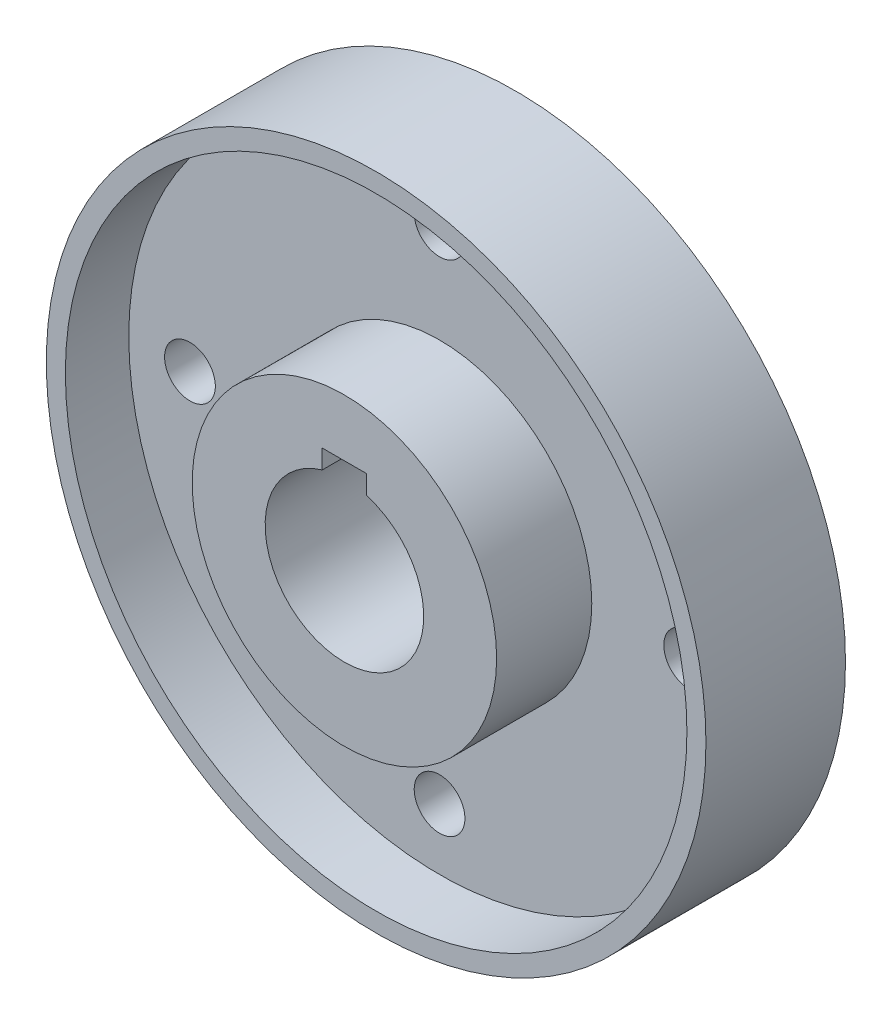
ISO-10303-21;
HEADER;
FILE_DESCRIPTION(('STEP AP214'),'2;1');
FILE_NAME('part.step','',(''),(''),'','','');
FILE_SCHEMA(('AUTOMOTIVE_DESIGN { 1 0 10303 214 1 1 1 1 }'));
ENDSEC;
DATA;
#1=APPLICATION_CONTEXT('core data for automotive mechanical design processes');
#2=APPLICATION_PROTOCOL_DEFINITION('international standard','automotive_design',2000,#1);
#3=PRODUCT_CONTEXT('',#1,'mechanical');
#4=PRODUCT('Part','Part','',(#3));
#5=PRODUCT_RELATED_PRODUCT_CATEGORY('part','',(#4));
#6=PRODUCT_DEFINITION_FORMATION('','',#4);
#7=PRODUCT_DEFINITION_CONTEXT('part definition',#1,'design');
#8=PRODUCT_DEFINITION('design','',#6,#7);
#9=PRODUCT_DEFINITION_SHAPE('','',#8);
#10=(LENGTH_UNIT() NAMED_UNIT(*) SI_UNIT(.MILLI.,.METRE.));
#11=(NAMED_UNIT(*) PLANE_ANGLE_UNIT() SI_UNIT($,.RADIAN.));
#12=(NAMED_UNIT(*) SI_UNIT($,.STERADIAN.) SOLID_ANGLE_UNIT());
#13=UNCERTAINTY_MEASURE_WITH_UNIT(LENGTH_MEASURE(1.E-05),#10,'distance_accuracy_value','');
#14=(GEOMETRIC_REPRESENTATION_CONTEXT(3) GLOBAL_UNCERTAINTY_ASSIGNED_CONTEXT((#13)) GLOBAL_UNIT_ASSIGNED_CONTEXT((#10,
#11,#12)) REPRESENTATION_CONTEXT('',''));
#15=CARTESIAN_POINT('',(0.,0.,0.));
#16=DIRECTION('',(0.,0.,1.));
#17=DIRECTION('',(1.,0.,0.));
#18=AXIS2_PLACEMENT_3D('',#15,#16,#17);
#19=CARTESIAN_POINT('',(0.,104.,0.));
#20=DIRECTION('',(0.,0.,1.));
#21=DIRECTION('',(1.,0.,0.));
#22=AXIS2_PLACEMENT_3D('',#19,#20,#21);
#23=PLANE('',#22);
#24=CARTESIAN_POINT('',(0.,-78.7044474679823,0.));
#25=DIRECTION('',(0.,0.,1.));
#26=DIRECTION('',(-1.,0.,0.));
#27=AXIS2_PLACEMENT_3D('',#24,#25,#26);
#28=CIRCLE('',#27,8.);
#29=CARTESIAN_POINT('',(-8.,-78.7044474679823,0.));
#30=VERTEX_POINT('',#29);
#31=EDGE_CURVE('E143',#30,#30,#28,.T.);
#32=ORIENTED_EDGE('',*,*,#31,.T.);
#33=EDGE_LOOP('',(#32));
#34=FACE_BOUND('',#33,.T.);
#35=CARTESIAN_POINT('',(0.,78.7044474679823,0.));
#36=DIRECTION('',(0.,0.,1.));
#37=DIRECTION('',(1.,0.,0.));
#38=AXIS2_PLACEMENT_3D('',#35,#36,#37);
#39=CIRCLE('',#38,8.);
#40=CARTESIAN_POINT('',(8.,78.7044474679823,0.));
#41=VERTEX_POINT('',#40);
#42=EDGE_CURVE('E137',#41,#41,#39,.T.);
#43=ORIENTED_EDGE('',*,*,#42,.T.);
#44=EDGE_LOOP('',(#43));
#45=FACE_BOUND('',#44,.T.);
#46=CARTESIAN_POINT('',(0.,0.,0.));
#47=DIRECTION('',(0.,0.,1.));
#48=DIRECTION('',(1.,0.,0.));
#49=AXIS2_PLACEMENT_3D('',#46,#47,#48);
#50=CIRCLE('',#49,104.);
#51=CARTESIAN_POINT('',(104.,0.,0.));
#52=VERTEX_POINT('',#51);
#53=EDGE_CURVE('E126',#52,#52,#50,.T.);
#54=ORIENTED_EDGE('',*,*,#53,.F.);
#55=EDGE_LOOP('',(#54));
#56=FACE_BOUND('',#55,.T.);
#57=CARTESIAN_POINT('',(0.,0.,0.));
#58=DIRECTION('',(0.,0.,1.));
#59=DIRECTION('',(1.,0.,0.));
#60=AXIS2_PLACEMENT_3D('',#57,#58,#59);
#61=CIRCLE('',#60,48.);
#62=CARTESIAN_POINT('',(48.,0.,0.));
#63=VERTEX_POINT('',#62);
#64=EDGE_CURVE('E123',#63,#63,#61,.T.);
#65=ORIENTED_EDGE('',*,*,#64,.T.);
#66=EDGE_LOOP('',(#65));
#67=FACE_BOUND('',#66,.T.);
#68=CARTESIAN_POINT('',(-78.7044474679823,-2.7479510961842E-13,0.));
#69=DIRECTION('',(0.,0.,1.));
#70=DIRECTION('',(0.,1.,0.));
#71=AXIS2_PLACEMENT_3D('',#68,#69,#70);
#72=CIRCLE('',#71,8.);
#73=CARTESIAN_POINT('',(-78.7044474679823,7.99999999999973,0.));
#74=VERTEX_POINT('',#73);
#75=EDGE_CURVE('E140',#74,#74,#72,.T.);
#76=ORIENTED_EDGE('',*,*,#75,.T.);
#77=EDGE_LOOP('',(#76));
#78=FACE_BOUND('',#77,.T.);
#79=CARTESIAN_POINT('',(78.7044474679823,8.24385328855259E-13,0.));
#80=DIRECTION('',(0.,0.,1.));
#81=DIRECTION('',(0.,-1.,0.));
#82=AXIS2_PLACEMENT_3D('',#79,#80,#81);
#83=CIRCLE('',#82,8.);
#84=CARTESIAN_POINT('',(78.7044474679824,-7.99999999999918,0.));
#85=VERTEX_POINT('',#84);
#86=EDGE_CURVE('E153',#85,#85,#83,.T.);
#87=ORIENTED_EDGE('',*,*,#86,.T.);
#88=EDGE_LOOP('',(#87));
#89=FACE_BOUND('',#88,.T.);
#90=ADVANCED_FACE('F37',(#34,#45,#56,#67,#78,#89),#23,.F.);
#91=CARTESIAN_POINT('',(0.,48.,24.));
#92=DIRECTION('',(0.,0.,-1.));
#93=DIRECTION('',(-1.,0.,0.));
#94=AXIS2_PLACEMENT_3D('',#91,#92,#93);
#95=PLANE('',#94);
#96=CARTESIAN_POINT('',(0.,-78.7044474679823,24.));
#97=DIRECTION('',(0.,0.,-1.));
#98=DIRECTION('',(-1.,0.,0.));
#99=AXIS2_PLACEMENT_3D('',#96,#97,#98);
#100=CIRCLE('',#99,8.);
#101=CARTESIAN_POINT('',(-8.,-78.7044474679823,24.));
#102=VERTEX_POINT('',#101);
#103=EDGE_CURVE('E141',#102,#102,#100,.F.);
#104=ORIENTED_EDGE('',*,*,#103,.F.);
#105=EDGE_LOOP('',(#104));
#106=FACE_BOUND('',#105,.T.);
#107=CARTESIAN_POINT('',(0.,78.7044474679823,24.));
#108=DIRECTION('',(0.,0.,-1.));
#109=DIRECTION('',(-1.,0.,0.));
#110=AXIS2_PLACEMENT_3D('',#107,#108,#109);
#111=CIRCLE('',#110,8.);
#112=CARTESIAN_POINT('',(-8.,78.7044474679823,24.));
#113=VERTEX_POINT('',#112);
#114=EDGE_CURVE('E94',#113,#113,#111,.F.);
#115=ORIENTED_EDGE('',*,*,#114,.F.);
#116=EDGE_LOOP('',(#115));
#117=FACE_BOUND('',#116,.T.);
#118=CARTESIAN_POINT('',(0.,0.,24.));
#119=DIRECTION('',(0.,0.,1.));
#120=DIRECTION('',(1.,0.,0.));
#121=AXIS2_PLACEMENT_3D('',#118,#119,#120);
#122=CIRCLE('',#121,48.);
#123=CARTESIAN_POINT('',(48.,0.,24.));
#124=VERTEX_POINT('',#123);
#125=EDGE_CURVE('E109',#124,#124,#122,.T.);
#126=ORIENTED_EDGE('',*,*,#125,.F.);
#127=EDGE_LOOP('',(#126));
#128=FACE_BOUND('',#127,.T.);
#129=CARTESIAN_POINT('',(0.,0.,24.));
#130=DIRECTION('',(0.,0.,1.));
#131=DIRECTION('',(1.,0.,0.));
#132=AXIS2_PLACEMENT_3D('',#129,#130,#131);
#133=CIRCLE('',#132,98.);
#134=CARTESIAN_POINT('',(98.,0.,24.));
#135=VERTEX_POINT('',#134);
#136=EDGE_CURVE('E106',#135,#135,#133,.T.);
#137=ORIENTED_EDGE('',*,*,#136,.T.);
#138=EDGE_LOOP('',(#137));
#139=FACE_BOUND('',#138,.T.);
#140=CARTESIAN_POINT('',(-78.7044474679823,-2.7479510961842E-13,24.));
#141=DIRECTION('',(0.,0.,-1.));
#142=DIRECTION('',(-1.,0.,0.));
#143=AXIS2_PLACEMENT_3D('',#140,#141,#142);
#144=CIRCLE('',#143,8.);
#145=CARTESIAN_POINT('',(-86.7044474679823,-2.7479510961842E-13,24.));
#146=VERTEX_POINT('',#145);
#147=EDGE_CURVE('E138',#146,#146,#144,.F.);
#148=ORIENTED_EDGE('',*,*,#147,.F.);
#149=EDGE_LOOP('',(#148));
#150=FACE_BOUND('',#149,.T.);
#151=CARTESIAN_POINT('',(78.7044474679823,8.24385328855259E-13,24.));
#152=DIRECTION('',(0.,0.,-1.));
#153=DIRECTION('',(-1.,0.,0.));
#154=AXIS2_PLACEMENT_3D('',#151,#152,#153);
#155=CIRCLE('',#154,8.);
#156=CARTESIAN_POINT('',(70.7044474679823,8.24385328855259E-13,24.));
#157=VERTEX_POINT('',#156);
#158=EDGE_CURVE('E41',#157,#157,#155,.F.);
#159=ORIENTED_EDGE('',*,*,#158,.F.);
#160=EDGE_LOOP('',(#159));
#161=FACE_BOUND('',#160,.T.);
#162=ADVANCED_FACE('F173',(#106,#117,#128,#139,#150,#161),#95,.F.);
#163=CARTESIAN_POINT('',(0.,48.,-3.));
#164=DIRECTION('',(0.,0.,1.));
#165=DIRECTION('',(1.,0.,0.));
#166=AXIS2_PLACEMENT_3D('',#163,#164,#165);
#167=PLANE('',#166);
#168=CARTESIAN_POINT('',(0.,0.,-3.));
#169=DIRECTION('',(0.,0.,1.));
#170=DIRECTION('',(1.,0.,0.));
#171=AXIS2_PLACEMENT_3D('',#168,#169,#170);
#172=CIRCLE('',#171,48.);
#173=CARTESIAN_POINT('',(48.,0.,-3.));
#174=VERTEX_POINT('',#173);
#175=EDGE_CURVE('E120',#174,#174,#172,.T.);
#176=ORIENTED_EDGE('',*,*,#175,.F.);
#177=EDGE_LOOP('',(#176));
#178=FACE_BOUND('',#177,.T.);
#179=DIRECTION('',(0.,-1.,0.));
#180=VECTOR('',#179,1.);
#181=CARTESIAN_POINT('',(7.,48.,-3.));
#182=LINE('',#181,#180);
#183=CARTESIAN_POINT('',(7.,30.,-3.));
#184=VERTEX_POINT('',#183);
#185=CARTESIAN_POINT('',(7.,24.,-3.));
#186=VERTEX_POINT('',#185);
#187=EDGE_CURVE('E62',#184,#186,#182,.T.);
#188=ORIENTED_EDGE('',*,*,#187,.F.);
#189=DIRECTION('',(1.,0.,0.));
#190=VECTOR('',#189,1.);
#191=CARTESIAN_POINT('',(0.,30.,-3.));
#192=LINE('',#191,#190);
#193=CARTESIAN_POINT('',(-7.,30.,-3.));
#194=VERTEX_POINT('',#193);
#195=EDGE_CURVE('E86',#194,#184,#192,.T.);
#196=ORIENTED_EDGE('',*,*,#195,.F.);
#197=DIRECTION('',(0.,1.,0.));
#198=VECTOR('',#197,1.);
#199=CARTESIAN_POINT('',(-7.,48.,-3.));
#200=LINE('',#199,#198);
#201=CARTESIAN_POINT('',(-7.,24.,-3.));
#202=VERTEX_POINT('',#201);
#203=EDGE_CURVE('E78',#202,#194,#200,.T.);
#204=ORIENTED_EDGE('',*,*,#203,.F.);
#205=CARTESIAN_POINT('',(0.,0.,-3.));
#206=DIRECTION('',(0.,0.,1.));
#207=DIRECTION('',(1.,0.,0.));
#208=AXIS2_PLACEMENT_3D('',#205,#206,#207);
#209=CIRCLE('',#208,25.);
#210=EDGE_CURVE('E118',#202,#186,#209,.T.);
#211=ORIENTED_EDGE('',*,*,#210,.T.);
#212=EDGE_LOOP('',(#188,#196,#204,#211));
#213=FACE_BOUND('',#212,.T.);
#214=ADVANCED_FACE('F96',(#178,#213),#167,.F.);
#215=CARTESIAN_POINT('',(0.,0.,52.4964718515854));
#216=DIRECTION('',(0.,0.,1.));
#217=DIRECTION('',(1.,0.,0.));
#218=AXIS2_PLACEMENT_3D('',#215,#216,#217);
#219=CYLINDRICAL_SURFACE('',#218,25.);
#220=DIRECTION('',(0.,0.,1.));
#221=VECTOR('',#220,1.);
#222=CARTESIAN_POINT('',(7.,24.,52.4964718515854));
#223=LINE('',#222,#221);
#224=CARTESIAN_POINT('',(7.,24.,54.));
#225=VERTEX_POINT('',#224);
#226=EDGE_CURVE('E97',#186,#225,#223,.T.);
#227=ORIENTED_EDGE('',*,*,#226,.F.);
#228=ORIENTED_EDGE('',*,*,#210,.F.);
#229=DIRECTION('',(0.,0.,1.));
#230=VECTOR('',#229,1.);
#231=CARTESIAN_POINT('',(-7.,24.,52.4964718515854));
#232=LINE('',#231,#230);
#233=CARTESIAN_POINT('',(-7.,24.,54.));
#234=VERTEX_POINT('',#233);
#235=EDGE_CURVE('E81',#234,#202,#232,.F.);
#236=ORIENTED_EDGE('',*,*,#235,.F.);
#237=CARTESIAN_POINT('',(0.,0.,54.));
#238=DIRECTION('',(0.,0.,1.));
#239=DIRECTION('',(1.,0.,0.));
#240=AXIS2_PLACEMENT_3D('',#237,#238,#239);
#241=CIRCLE('',#240,25.);
#242=EDGE_CURVE('E115',#234,#225,#241,.T.);
#243=ORIENTED_EDGE('',*,*,#242,.T.);
#244=EDGE_LOOP('',(#227,#228,#236,#243));
#245=FACE_BOUND('',#244,.T.);
#246=ADVANCED_FACE('F164',(#245),#219,.F.);
#247=CARTESIAN_POINT('',(0.,25.,54.));
#248=DIRECTION('',(0.,0.,-1.));
#249=DIRECTION('',(-1.,0.,0.));
#250=AXIS2_PLACEMENT_3D('',#247,#248,#249);
#251=PLANE('',#250);
#252=CARTESIAN_POINT('',(0.,0.,54.));
#253=DIRECTION('',(0.,0.,1.));
#254=DIRECTION('',(1.,0.,0.));
#255=AXIS2_PLACEMENT_3D('',#252,#253,#254);
#256=CIRCLE('',#255,48.);
#257=CARTESIAN_POINT('',(48.,0.,54.));
#258=VERTEX_POINT('',#257);
#259=EDGE_CURVE('E112',#258,#258,#256,.T.);
#260=ORIENTED_EDGE('',*,*,#259,.T.);
#261=EDGE_LOOP('',(#260));
#262=FACE_BOUND('',#261,.T.);
#263=DIRECTION('',(0.,1.,0.));
#264=VECTOR('',#263,1.);
#265=CARTESIAN_POINT('',(7.,25.,54.));
#266=LINE('',#265,#264);
#267=CARTESIAN_POINT('',(7.,30.,54.));
#268=VERTEX_POINT('',#267);
#269=EDGE_CURVE('E11',#225,#268,#266,.T.);
#270=ORIENTED_EDGE('',*,*,#269,.F.);
#271=ORIENTED_EDGE('',*,*,#242,.F.);
#272=DIRECTION('',(0.,-1.,0.));
#273=VECTOR('',#272,1.);
#274=CARTESIAN_POINT('',(-7.,25.,54.));
#275=LINE('',#274,#273);
#276=CARTESIAN_POINT('',(-7.,30.,54.));
#277=VERTEX_POINT('',#276);
#278=EDGE_CURVE('E132',#277,#234,#275,.T.);
#279=ORIENTED_EDGE('',*,*,#278,.F.);
#280=DIRECTION('',(-1.,0.,0.));
#281=VECTOR('',#280,1.);
#282=CARTESIAN_POINT('',(0.,30.,54.));
#283=LINE('',#282,#281);
#284=EDGE_CURVE('E46',#268,#277,#283,.T.);
#285=ORIENTED_EDGE('',*,*,#284,.F.);
#286=EDGE_LOOP('',(#270,#271,#279,#285));
#287=FACE_BOUND('',#286,.T.);
#288=ADVANCED_FACE('F161',(#262,#287),#251,.F.);
#289=CARTESIAN_POINT('',(0.,98.,44.));
#290=DIRECTION('',(0.,0.,-1.));
#291=DIRECTION('',(-1.,0.,0.));
#292=AXIS2_PLACEMENT_3D('',#289,#290,#291);
#293=PLANE('',#292);
#294=CARTESIAN_POINT('',(0.,0.,44.));
#295=DIRECTION('',(0.,0.,1.));
#296=DIRECTION('',(1.,0.,0.));
#297=AXIS2_PLACEMENT_3D('',#294,#295,#296);
#298=CIRCLE('',#297,98.);
#299=CARTESIAN_POINT('',(98.,0.,44.));
#300=VERTEX_POINT('',#299);
#301=EDGE_CURVE('E103',#300,#300,#298,.T.);
#302=ORIENTED_EDGE('',*,*,#301,.F.);
#303=EDGE_LOOP('',(#302));
#304=FACE_BOUND('',#303,.T.);
#305=CARTESIAN_POINT('',(0.,0.,44.));
#306=DIRECTION('',(0.,0.,1.));
#307=DIRECTION('',(1.,0.,0.));
#308=AXIS2_PLACEMENT_3D('',#305,#306,#307);
#309=CIRCLE('',#308,104.);
#310=CARTESIAN_POINT('',(104.,0.,44.));
#311=VERTEX_POINT('',#310);
#312=EDGE_CURVE('E129',#311,#311,#309,.T.);
#313=ORIENTED_EDGE('',*,*,#312,.T.);
#314=EDGE_LOOP('',(#313));
#315=FACE_BOUND('',#314,.T.);
#316=ADVANCED_FACE('F39',(#304,#315),#293,.F.);
#317=CARTESIAN_POINT('',(0.,0.,52.4964718515854));
#318=DIRECTION('',(0.,0.,1.));
#319=DIRECTION('',(1.,0.,0.));
#320=AXIS2_PLACEMENT_3D('',#317,#318,#319);
#321=CYLINDRICAL_SURFACE('',#320,104.);
#322=ORIENTED_EDGE('',*,*,#312,.F.);
#323=EDGE_LOOP('',(#322));
#324=FACE_BOUND('',#323,.T.);
#325=ORIENTED_EDGE('',*,*,#53,.T.);
#326=EDGE_LOOP('',(#325));
#327=FACE_BOUND('',#326,.T.);
#328=ADVANCED_FACE('F186',(#324,#327),#321,.T.);
#329=CARTESIAN_POINT('',(0.,0.,52.4964718515854));
#330=DIRECTION('',(0.,0.,1.));
#331=DIRECTION('',(1.,0.,0.));
#332=AXIS2_PLACEMENT_3D('',#329,#330,#331);
#333=CYLINDRICAL_SURFACE('',#332,48.);
#334=ORIENTED_EDGE('',*,*,#64,.F.);
#335=EDGE_LOOP('',(#334));
#336=FACE_BOUND('',#335,.T.);
#337=ORIENTED_EDGE('',*,*,#175,.T.);
#338=EDGE_LOOP('',(#337));
#339=FACE_BOUND('',#338,.T.);
#340=ADVANCED_FACE('F185',(#336,#339),#333,.T.);
#341=CARTESIAN_POINT('',(0.,0.,52.4964718515854));
#342=DIRECTION('',(0.,0.,1.));
#343=DIRECTION('',(1.,0.,0.));
#344=AXIS2_PLACEMENT_3D('',#341,#342,#343);
#345=CYLINDRICAL_SURFACE('',#344,48.);
#346=ORIENTED_EDGE('',*,*,#259,.F.);
#347=EDGE_LOOP('',(#346));
#348=FACE_BOUND('',#347,.T.);
#349=ORIENTED_EDGE('',*,*,#125,.T.);
#350=EDGE_LOOP('',(#349));
#351=FACE_BOUND('',#350,.T.);
#352=ADVANCED_FACE('F193',(#348,#351),#345,.T.);
#353=CARTESIAN_POINT('',(0.,0.,52.4964718515854));
#354=DIRECTION('',(0.,0.,1.));
#355=DIRECTION('',(1.,0.,0.));
#356=AXIS2_PLACEMENT_3D('',#353,#354,#355);
#357=CYLINDRICAL_SURFACE('',#356,98.);
#358=ORIENTED_EDGE('',*,*,#136,.F.);
#359=EDGE_LOOP('',(#358));
#360=FACE_BOUND('',#359,.T.);
#361=ORIENTED_EDGE('',*,*,#301,.T.);
#362=EDGE_LOOP('',(#361));
#363=FACE_BOUND('',#362,.T.);
#364=ADVANCED_FACE('F235',(#360,#363),#357,.F.);
#365=CARTESIAN_POINT('',(7.,30.,73.));
#366=DIRECTION('',(-1.,0.,0.));
#367=DIRECTION('',(0.,0.,1.));
#368=AXIS2_PLACEMENT_3D('',#365,#366,#367);
#369=PLANE('',#368);
#370=ORIENTED_EDGE('',*,*,#187,.T.);
#371=ORIENTED_EDGE('',*,*,#226,.T.);
#372=ORIENTED_EDGE('',*,*,#269,.T.);
#373=DIRECTION('',(0.,0.,-1.));
#374=VECTOR('',#373,1.);
#375=CARTESIAN_POINT('',(7.,30.,73.));
#376=LINE('',#375,#374);
#377=EDGE_CURVE('E93',#268,#184,#376,.T.);
#378=ORIENTED_EDGE('',*,*,#377,.T.);
#379=EDGE_LOOP('',(#370,#371,#372,#378));
#380=FACE_BOUND('',#379,.T.);
#381=ADVANCED_FACE('F158',(#380),#369,.T.);
#382=CARTESIAN_POINT('',(-7.,30.,73.));
#383=DIRECTION('',(0.,-1.,0.));
#384=DIRECTION('',(0.,0.,-1.));
#385=AXIS2_PLACEMENT_3D('',#382,#383,#384);
#386=PLANE('',#385);
#387=ORIENTED_EDGE('',*,*,#195,.T.);
#388=ORIENTED_EDGE('',*,*,#377,.F.);
#389=ORIENTED_EDGE('',*,*,#284,.T.);
#390=DIRECTION('',(0.,0.,-1.));
#391=VECTOR('',#390,1.);
#392=CARTESIAN_POINT('',(-7.,30.,73.));
#393=LINE('',#392,#391);
#394=EDGE_CURVE('E54',#277,#194,#393,.T.);
#395=ORIENTED_EDGE('',*,*,#394,.T.);
#396=EDGE_LOOP('',(#387,#388,#389,#395));
#397=FACE_BOUND('',#396,.T.);
#398=ADVANCED_FACE('F89',(#397),#386,.T.);
#399=CARTESIAN_POINT('',(-7.,30.,73.));
#400=DIRECTION('',(1.,0.,0.));
#401=DIRECTION('',(0.,1.,0.));
#402=AXIS2_PLACEMENT_3D('',#399,#400,#401);
#403=PLANE('',#402);
#404=ORIENTED_EDGE('',*,*,#203,.T.);
#405=ORIENTED_EDGE('',*,*,#394,.F.);
#406=ORIENTED_EDGE('',*,*,#278,.T.);
#407=ORIENTED_EDGE('',*,*,#235,.T.);
#408=EDGE_LOOP('',(#404,#405,#406,#407));
#409=FACE_BOUND('',#408,.T.);
#410=ADVANCED_FACE('F79',(#409),#403,.T.);
#411=CARTESIAN_POINT('',(0.,78.7044474679823,217.));
#412=DIRECTION('',(0.,0.,-1.));
#413=DIRECTION('',(-1.,0.,0.));
#414=AXIS2_PLACEMENT_3D('',#411,#412,#413);
#415=CYLINDRICAL_SURFACE('',#414,8.);
#416=ORIENTED_EDGE('',*,*,#42,.F.);
#417=EDGE_LOOP('',(#416));
#418=FACE_BOUND('',#417,.T.);
#419=ORIENTED_EDGE('',*,*,#114,.T.);
#420=EDGE_LOOP('',(#419));
#421=FACE_BOUND('',#420,.T.);
#422=ADVANCED_FACE('F224',(#418,#421),#415,.F.);
#423=CARTESIAN_POINT('',(-78.7044474679823,-2.7479510961842E-13,217.));
#424=DIRECTION('',(0.,0.,-1.));
#425=DIRECTION('',(-1.,0.,0.));
#426=AXIS2_PLACEMENT_3D('',#423,#424,#425);
#427=CYLINDRICAL_SURFACE('',#426,8.);
#428=ORIENTED_EDGE('',*,*,#75,.F.);
#429=EDGE_LOOP('',(#428));
#430=FACE_BOUND('',#429,.T.);
#431=ORIENTED_EDGE('',*,*,#147,.T.);
#432=EDGE_LOOP('',(#431));
#433=FACE_BOUND('',#432,.T.);
#434=ADVANCED_FACE('F218',(#430,#433),#427,.F.);
#435=CARTESIAN_POINT('',(0.,-78.7044474679823,217.));
#436=DIRECTION('',(0.,0.,-1.));
#437=DIRECTION('',(-1.,0.,0.));
#438=AXIS2_PLACEMENT_3D('',#435,#436,#437);
#439=CYLINDRICAL_SURFACE('',#438,8.);
#440=ORIENTED_EDGE('',*,*,#31,.F.);
#441=EDGE_LOOP('',(#440));
#442=FACE_BOUND('',#441,.T.);
#443=ORIENTED_EDGE('',*,*,#103,.T.);
#444=EDGE_LOOP('',(#443));
#445=FACE_BOUND('',#444,.T.);
#446=ADVANCED_FACE('F211',(#442,#445),#439,.F.);
#447=CARTESIAN_POINT('',(78.7044474679823,8.24385328855259E-13,217.));
#448=DIRECTION('',(0.,0.,-1.));
#449=DIRECTION('',(-1.,0.,0.));
#450=AXIS2_PLACEMENT_3D('',#447,#448,#449);
#451=CYLINDRICAL_SURFACE('',#450,8.);
#452=ORIENTED_EDGE('',*,*,#86,.F.);
#453=EDGE_LOOP('',(#452));
#454=FACE_BOUND('',#453,.T.);
#455=ORIENTED_EDGE('',*,*,#158,.T.);
#456=EDGE_LOOP('',(#455));
#457=FACE_BOUND('',#456,.T.);
#458=ADVANCED_FACE('F208',(#454,#457),#451,.F.);
#459=CLOSED_SHELL('',(#90,#162,#214,#246,#288,#316,#328,#340,#352,#364,#381,#398,#410,#422,#434,
#446,#458));
#460=MANIFOLD_SOLID_BREP('B2',#459);
#461=ADVANCED_BREP_SHAPE_REPRESENTATION('',(#18,#460),#14);
#462=SHAPE_DEFINITION_REPRESENTATION(#9,#461);
ENDSEC;
END-ISO-10303-21;
